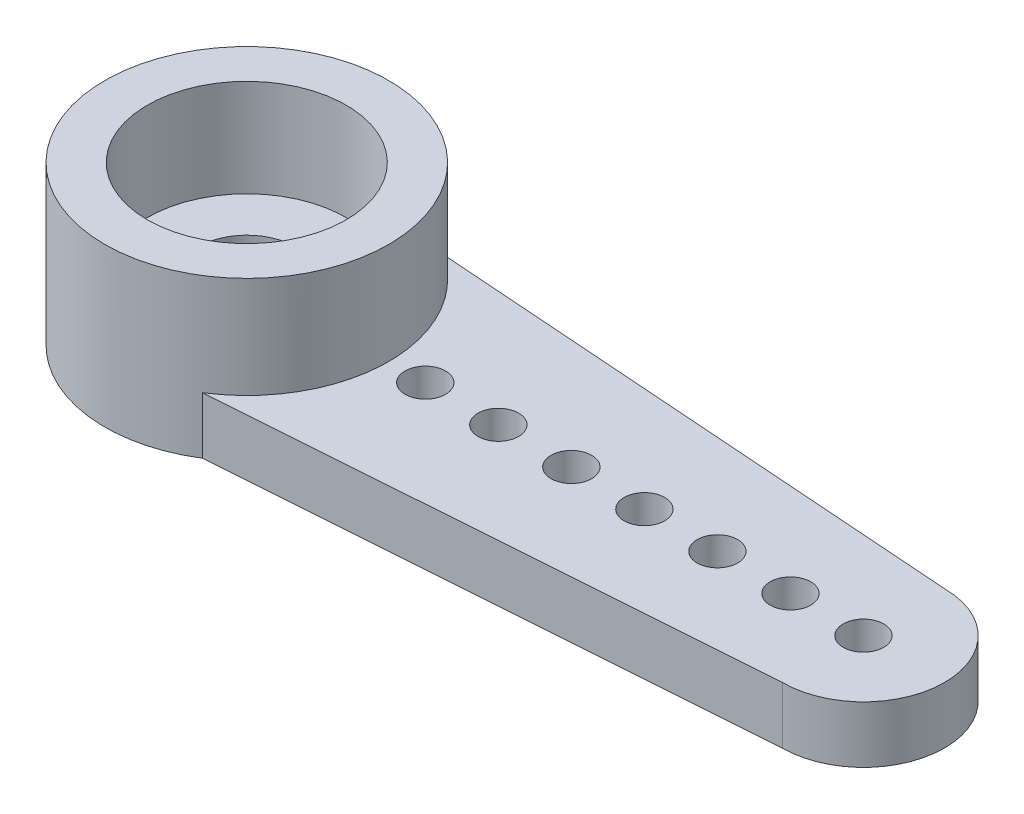
ISO-10303-21;
HEADER;
FILE_DESCRIPTION(('STEP AP214'),'2;1');
FILE_NAME('part.step','',(''),(''),'','','');
FILE_SCHEMA(('AUTOMOTIVE_DESIGN { 1 0 10303 214 1 1 1 1 }'));
ENDSEC;
DATA;
#1=APPLICATION_CONTEXT('core data for automotive mechanical design processes');
#2=APPLICATION_PROTOCOL_DEFINITION('international standard','automotive_design',2000,#1);
#3=PRODUCT_CONTEXT('',#1,'mechanical');
#4=PRODUCT('Part','Part','',(#3));
#5=PRODUCT_RELATED_PRODUCT_CATEGORY('part','',(#4));
#6=PRODUCT_DEFINITION_FORMATION('','',#4);
#7=PRODUCT_DEFINITION_CONTEXT('part definition',#1,'design');
#8=PRODUCT_DEFINITION('design','',#6,#7);
#9=PRODUCT_DEFINITION_SHAPE('','',#8);
#10=(LENGTH_UNIT() NAMED_UNIT(*) SI_UNIT(.MILLI.,.METRE.));
#11=(NAMED_UNIT(*) PLANE_ANGLE_UNIT() SI_UNIT($,.RADIAN.));
#12=(NAMED_UNIT(*) SI_UNIT($,.STERADIAN.) SOLID_ANGLE_UNIT());
#13=UNCERTAINTY_MEASURE_WITH_UNIT(LENGTH_MEASURE(1.E-05),#10,'distance_accuracy_value','');
#14=(GEOMETRIC_REPRESENTATION_CONTEXT(3) GLOBAL_UNCERTAINTY_ASSIGNED_CONTEXT((#13)) GLOBAL_UNIT_ASSIGNED_CONTEXT((#10,
#11,#12)) REPRESENTATION_CONTEXT('',''));
#15=CARTESIAN_POINT('',(0.,0.,0.));
#16=DIRECTION('',(0.,0.,1.));
#17=DIRECTION('',(1.,0.,0.));
#18=AXIS2_PLACEMENT_3D('',#15,#16,#17);
#19=CARTESIAN_POINT('',(-15.2,1.4,0.));
#20=DIRECTION('',(0.,1.,0.));
#21=DIRECTION('',(0.,0.,1.));
#22=AXIS2_PLACEMENT_3D('',#19,#20,#21);
#23=PLANE('',#22);
#24=CARTESIAN_POINT('',(6.2,1.4,0.));
#25=DIRECTION('',(0.,1.,0.));
#26=DIRECTION('',(0.,0.,1.));
#27=AXIS2_PLACEMENT_3D('',#24,#25,#26);
#28=CIRCLE('',#27,0.499999999999997);
#29=CARTESIAN_POINT('',(6.2,1.4,0.500000000000053));
#30=VERTEX_POINT('',#29);
#31=EDGE_CURVE('E126',#30,#30,#28,.T.);
#32=ORIENTED_EDGE('',*,*,#31,.F.);
#33=EDGE_LOOP('',(#32));
#34=FACE_BOUND('',#33,.T.);
#35=CARTESIAN_POINT('',(9.8,1.4,0.));
#36=DIRECTION('',(0.,1.,0.));
#37=DIRECTION('',(0.,0.,1.));
#38=AXIS2_PLACEMENT_3D('',#35,#36,#37);
#39=CIRCLE('',#38,0.499999999999997);
#40=CARTESIAN_POINT('',(9.8,1.4,0.500000000000028));
#41=VERTEX_POINT('',#40);
#42=EDGE_CURVE('E138',#41,#41,#39,.T.);
#43=ORIENTED_EDGE('',*,*,#42,.F.);
#44=EDGE_LOOP('',(#43));
#45=FACE_BOUND('',#44,.T.);
#46=CARTESIAN_POINT('',(13.4,1.4,0.));
#47=DIRECTION('',(0.,1.,0.));
#48=DIRECTION('',(0.,0.,1.));
#49=AXIS2_PLACEMENT_3D('',#46,#47,#48);
#50=CIRCLE('',#49,0.499999999999997);
#51=CARTESIAN_POINT('',(13.4,1.4,0.500000000000003));
#52=VERTEX_POINT('',#51);
#53=EDGE_CURVE('E150',#52,#52,#50,.T.);
#54=ORIENTED_EDGE('',*,*,#53,.F.);
#55=EDGE_LOOP('',(#54));
#56=FACE_BOUND('',#55,.T.);
#57=CARTESIAN_POINT('',(15.2,1.4,0.));
#58=DIRECTION('',(0.,1.,0.));
#59=DIRECTION('',(0.,0.,1.));
#60=AXIS2_PLACEMENT_3D('',#57,#58,#59);
#61=CIRCLE('',#60,0.499999999999997);
#62=CARTESIAN_POINT('',(15.2,1.4,0.49999999999999));
#63=VERTEX_POINT('',#62);
#64=EDGE_CURVE('E156',#63,#63,#61,.T.);
#65=ORIENTED_EDGE('',*,*,#64,.F.);
#66=EDGE_LOOP('',(#65));
#67=FACE_BOUND('',#66,.T.);
#68=CARTESIAN_POINT('',(11.6,1.4,0.));
#69=DIRECTION('',(0.,1.,0.));
#70=DIRECTION('',(0.,0.,1.));
#71=AXIS2_PLACEMENT_3D('',#68,#69,#70);
#72=CIRCLE('',#71,0.499999999999999);
#73=CARTESIAN_POINT('',(11.6,1.4,0.500000000000017));
#74=VERTEX_POINT('',#73);
#75=EDGE_CURVE('E144',#74,#74,#72,.T.);
#76=ORIENTED_EDGE('',*,*,#75,.F.);
#77=EDGE_LOOP('',(#76));
#78=FACE_BOUND('',#77,.T.);
#79=CARTESIAN_POINT('',(8.,1.4,0.));
#80=DIRECTION('',(0.,1.,0.));
#81=DIRECTION('',(0.,0.,1.));
#82=AXIS2_PLACEMENT_3D('',#79,#80,#81);
#83=CIRCLE('',#82,0.499999999999997);
#84=CARTESIAN_POINT('',(8.,1.4,0.500000000000041));
#85=VERTEX_POINT('',#84);
#86=EDGE_CURVE('E132',#85,#85,#83,.T.);
#87=ORIENTED_EDGE('',*,*,#86,.F.);
#88=EDGE_LOOP('',(#87));
#89=FACE_BOUND('',#88,.T.);
#90=CARTESIAN_POINT('',(4.4,1.4,0.));
#91=DIRECTION('',(0.,1.,0.));
#92=DIRECTION('',(0.,0.,1.));
#93=AXIS2_PLACEMENT_3D('',#90,#91,#92);
#94=CIRCLE('',#93,0.499999999999997);
#95=CARTESIAN_POINT('',(4.4,1.4,0.500000000000066));
#96=VERTEX_POINT('',#95);
#97=EDGE_CURVE('E120',#96,#96,#94,.T.);
#98=ORIENTED_EDGE('',*,*,#97,.F.);
#99=EDGE_LOOP('',(#98));
#100=FACE_BOUND('',#99,.T.);
#101=CARTESIAN_POINT('',(0.,1.4,0.));
#102=DIRECTION('',(0.,1.,0.));
#103=DIRECTION('',(0.,0.,1.));
#104=AXIS2_PLACEMENT_3D('',#101,#102,#103);
#105=CIRCLE('',#104,3.5);
#106=CARTESIAN_POINT('',(1.86858471289894,1.4,2.95945791838985));
#107=VERTEX_POINT('',#106);
#108=CARTESIAN_POINT('',(1.86858471289894,1.4,-2.95945791838985));
#109=VERTEX_POINT('',#108);
#110=EDGE_CURVE('E86',#107,#109,#105,.T.);
#111=ORIENTED_EDGE('',*,*,#110,.F.);
#112=DIRECTION('',(0.997420198870011,0.,-0.0717840294641297));
#113=VECTOR('',#112,1.);
#114=CARTESIAN_POINT('',(-14.9001527327747,1.4,4.16629887091939));
#115=LINE('',#114,#113);
#116=CARTESIAN_POINT('',(15.2,1.4,2.));
#117=VERTEX_POINT('',#116);
#118=EDGE_CURVE('E100',#107,#117,#115,.T.);
#119=ORIENTED_EDGE('',*,*,#118,.T.);
#120=CARTESIAN_POINT('',(15.2,1.4,0.));
#121=DIRECTION('',(0.,1.,0.));
#122=DIRECTION('',(0.,0.,-1.));
#123=AXIS2_PLACEMENT_3D('',#120,#121,#122);
#124=CIRCLE('',#123,2.);
#125=CARTESIAN_POINT('',(15.2,1.4,-2.));
#126=VERTEX_POINT('',#125);
#127=EDGE_CURVE('E162',#117,#126,#124,.T.);
#128=ORIENTED_EDGE('',*,*,#127,.T.);
#129=DIRECTION('',(-0.997420198870011,0.,-0.0717840294641295));
#130=VECTOR('',#129,1.);
#131=CARTESIAN_POINT('',(-14.9001527327747,1.4,-4.16629887091939));
#132=LINE('',#131,#130);
#133=EDGE_CURVE('E97',#126,#109,#132,.T.);
#134=ORIENTED_EDGE('',*,*,#133,.T.);
#135=EDGE_LOOP('',(#111,#119,#128,#134));
#136=FACE_BOUND('',#135,.T.);
#137=ADVANCED_FACE('F33',(#34,#45,#56,#67,#78,#89,#100,#136),#23,.T.);
#138=CARTESIAN_POINT('',(-15.2,0.,0.));
#139=DIRECTION('',(0.,1.,0.));
#140=DIRECTION('',(0.,0.,1.));
#141=AXIS2_PLACEMENT_3D('',#138,#139,#140);
#142=PLANE('',#141);
#143=CARTESIAN_POINT('',(0.,0.,0.));
#144=DIRECTION('',(0.,-1.,0.));
#145=DIRECTION('',(0.,0.,-1.));
#146=AXIS2_PLACEMENT_3D('',#143,#144,#145);
#147=CIRCLE('',#146,2.35);
#148=CARTESIAN_POINT('',(0.,0.,-2.35));
#149=VERTEX_POINT('',#148);
#150=EDGE_CURVE('E112',#149,#149,#147,.T.);
#151=ORIENTED_EDGE('',*,*,#150,.F.);
#152=EDGE_LOOP('',(#151));
#153=FACE_BOUND('',#152,.T.);
#154=CARTESIAN_POINT('',(15.2,0.,0.));
#155=DIRECTION('',(0.,1.,0.));
#156=DIRECTION('',(0.,0.,1.));
#157=AXIS2_PLACEMENT_3D('',#154,#155,#156);
#158=CIRCLE('',#157,0.499999999999997);
#159=CARTESIAN_POINT('',(15.2,0.,0.49999999999999));
#160=VERTEX_POINT('',#159);
#161=EDGE_CURVE('E153',#160,#160,#158,.T.);
#162=ORIENTED_EDGE('',*,*,#161,.T.);
#163=EDGE_LOOP('',(#162));
#164=FACE_BOUND('',#163,.T.);
#165=CARTESIAN_POINT('',(13.4,0.,0.));
#166=DIRECTION('',(0.,1.,0.));
#167=DIRECTION('',(0.,0.,1.));
#168=AXIS2_PLACEMENT_3D('',#165,#166,#167);
#169=CIRCLE('',#168,0.499999999999997);
#170=CARTESIAN_POINT('',(13.4,0.,0.500000000000003));
#171=VERTEX_POINT('',#170);
#172=EDGE_CURVE('E147',#171,#171,#169,.T.);
#173=ORIENTED_EDGE('',*,*,#172,.T.);
#174=EDGE_LOOP('',(#173));
#175=FACE_BOUND('',#174,.T.);
#176=CARTESIAN_POINT('',(11.6,0.,0.));
#177=DIRECTION('',(0.,1.,0.));
#178=DIRECTION('',(0.,0.,1.));
#179=AXIS2_PLACEMENT_3D('',#176,#177,#178);
#180=CIRCLE('',#179,0.499999999999999);
#181=CARTESIAN_POINT('',(11.6,0.,0.500000000000017));
#182=VERTEX_POINT('',#181);
#183=EDGE_CURVE('E141',#182,#182,#180,.T.);
#184=ORIENTED_EDGE('',*,*,#183,.T.);
#185=EDGE_LOOP('',(#184));
#186=FACE_BOUND('',#185,.T.);
#187=CARTESIAN_POINT('',(9.8,0.,0.));
#188=DIRECTION('',(0.,1.,0.));
#189=DIRECTION('',(0.,0.,1.));
#190=AXIS2_PLACEMENT_3D('',#187,#188,#189);
#191=CIRCLE('',#190,0.499999999999997);
#192=CARTESIAN_POINT('',(9.8,0.,0.500000000000028));
#193=VERTEX_POINT('',#192);
#194=EDGE_CURVE('E135',#193,#193,#191,.T.);
#195=ORIENTED_EDGE('',*,*,#194,.T.);
#196=EDGE_LOOP('',(#195));
#197=FACE_BOUND('',#196,.T.);
#198=CARTESIAN_POINT('',(8.,0.,0.));
#199=DIRECTION('',(0.,1.,0.));
#200=DIRECTION('',(0.,0.,1.));
#201=AXIS2_PLACEMENT_3D('',#198,#199,#200);
#202=CIRCLE('',#201,0.499999999999997);
#203=CARTESIAN_POINT('',(8.,0.,0.500000000000041));
#204=VERTEX_POINT('',#203);
#205=EDGE_CURVE('E129',#204,#204,#202,.T.);
#206=ORIENTED_EDGE('',*,*,#205,.T.);
#207=EDGE_LOOP('',(#206));
#208=FACE_BOUND('',#207,.T.);
#209=CARTESIAN_POINT('',(6.2,0.,0.));
#210=DIRECTION('',(0.,1.,0.));
#211=DIRECTION('',(0.,0.,1.));
#212=AXIS2_PLACEMENT_3D('',#209,#210,#211);
#213=CIRCLE('',#212,0.499999999999997);
#214=CARTESIAN_POINT('',(6.2,0.,0.500000000000053));
#215=VERTEX_POINT('',#214);
#216=EDGE_CURVE('E123',#215,#215,#213,.T.);
#217=ORIENTED_EDGE('',*,*,#216,.T.);
#218=EDGE_LOOP('',(#217));
#219=FACE_BOUND('',#218,.T.);
#220=CARTESIAN_POINT('',(4.4,0.,0.));
#221=DIRECTION('',(0.,1.,0.));
#222=DIRECTION('',(0.,0.,1.));
#223=AXIS2_PLACEMENT_3D('',#220,#221,#222);
#224=CIRCLE('',#223,0.499999999999997);
#225=CARTESIAN_POINT('',(4.4,0.,0.500000000000066));
#226=VERTEX_POINT('',#225);
#227=EDGE_CURVE('E117',#226,#226,#224,.T.);
#228=ORIENTED_EDGE('',*,*,#227,.T.);
#229=EDGE_LOOP('',(#228));
#230=FACE_BOUND('',#229,.T.);
#231=CARTESIAN_POINT('',(0.,0.,0.));
#232=DIRECTION('',(0.,-1.,0.));
#233=DIRECTION('',(0.,0.,-1.));
#234=AXIS2_PLACEMENT_3D('',#231,#232,#233);
#235=CIRCLE('',#234,3.5);
#236=CARTESIAN_POINT('',(1.86858471289894,0.,2.95945791838985));
#237=VERTEX_POINT('',#236);
#238=CARTESIAN_POINT('',(1.86858471289894,0.,-2.95945791838985));
#239=VERTEX_POINT('',#238);
#240=EDGE_CURVE('E71',#237,#239,#235,.T.);
#241=ORIENTED_EDGE('',*,*,#240,.T.);
#242=DIRECTION('',(0.997420198870011,0.,0.0717840294641295));
#243=VECTOR('',#242,1.);
#244=CARTESIAN_POINT('',(1.86858471289894,0.,-2.95945791838985));
#245=LINE('',#244,#243);
#246=CARTESIAN_POINT('',(15.2,0.,-2.));
#247=VERTEX_POINT('',#246);
#248=EDGE_CURVE('E76',#239,#247,#245,.T.);
#249=ORIENTED_EDGE('',*,*,#248,.T.);
#250=CARTESIAN_POINT('',(15.2,0.,0.));
#251=DIRECTION('',(0.,1.,0.));
#252=DIRECTION('',(0.,0.,-1.));
#253=AXIS2_PLACEMENT_3D('',#250,#251,#252);
#254=CIRCLE('',#253,2.);
#255=CARTESIAN_POINT('',(15.2,0.,1.99999999999999));
#256=VERTEX_POINT('',#255);
#257=EDGE_CURVE('E159',#256,#247,#254,.T.);
#258=ORIENTED_EDGE('',*,*,#257,.F.);
#259=DIRECTION('',(-0.997420198870011,0.,0.0717840294641296));
#260=VECTOR('',#259,1.);
#261=CARTESIAN_POINT('',(15.2,0.,2.));
#262=LINE('',#261,#260);
#263=EDGE_CURVE('E48',#256,#237,#262,.T.);
#264=ORIENTED_EDGE('',*,*,#263,.T.);
#265=EDGE_LOOP('',(#241,#249,#258,#264));
#266=FACE_BOUND('',#265,.T.);
#267=ADVANCED_FACE('F73',(#153,#164,#175,#186,#197,#208,#219,#230,#266),#142,.F.);
#268=CARTESIAN_POINT('',(15.2,1.4,0.));
#269=DIRECTION('',(0.,-1.,0.));
#270=DIRECTION('',(0.,0.,-1.));
#271=AXIS2_PLACEMENT_3D('',#268,#269,#270);
#272=CYLINDRICAL_SURFACE('',#271,2.);
#273=ORIENTED_EDGE('',*,*,#257,.T.);
#274=DIRECTION('',(0.,-1.,0.));
#275=VECTOR('',#274,1.);
#276=CARTESIAN_POINT('',(15.2,1.4,-2.00000000000001));
#277=LINE('',#276,#275);
#278=EDGE_CURVE('E93',#126,#247,#277,.T.);
#279=ORIENTED_EDGE('',*,*,#278,.F.);
#280=ORIENTED_EDGE('',*,*,#127,.F.);
#281=DIRECTION('',(0.,-1.,0.));
#282=VECTOR('',#281,1.);
#283=CARTESIAN_POINT('',(15.2,1.4,1.99999999999999));
#284=LINE('',#283,#282);
#285=EDGE_CURVE('E41',#117,#256,#284,.T.);
#286=ORIENTED_EDGE('',*,*,#285,.T.);
#287=EDGE_LOOP('',(#273,#279,#280,#286));
#288=FACE_BOUND('',#287,.T.);
#289=ADVANCED_FACE('F35',(#288),#272,.T.);
#290=CARTESIAN_POINT('',(15.2,1.4,0.));
#291=DIRECTION('',(0.,-1.,0.));
#292=DIRECTION('',(0.,0.,-1.));
#293=AXIS2_PLACEMENT_3D('',#290,#291,#292);
#294=CYLINDRICAL_SURFACE('',#293,0.499999999999997);
#295=ORIENTED_EDGE('',*,*,#64,.T.);
#296=EDGE_LOOP('',(#295));
#297=FACE_BOUND('',#296,.T.);
#298=ORIENTED_EDGE('',*,*,#161,.F.);
#299=EDGE_LOOP('',(#298));
#300=FACE_BOUND('',#299,.T.);
#301=ADVANCED_FACE('F222',(#297,#300),#294,.F.);
#302=CARTESIAN_POINT('',(13.4,1.4,0.));
#303=DIRECTION('',(0.,-1.,0.));
#304=DIRECTION('',(0.,0.,-1.));
#305=AXIS2_PLACEMENT_3D('',#302,#303,#304);
#306=CYLINDRICAL_SURFACE('',#305,0.499999999999997);
#307=ORIENTED_EDGE('',*,*,#53,.T.);
#308=EDGE_LOOP('',(#307));
#309=FACE_BOUND('',#308,.T.);
#310=ORIENTED_EDGE('',*,*,#172,.F.);
#311=EDGE_LOOP('',(#310));
#312=FACE_BOUND('',#311,.T.);
#313=ADVANCED_FACE('F225',(#309,#312),#306,.F.);
#314=CARTESIAN_POINT('',(11.6,1.4,0.));
#315=DIRECTION('',(0.,-1.,0.));
#316=DIRECTION('',(0.,0.,-1.));
#317=AXIS2_PLACEMENT_3D('',#314,#315,#316);
#318=CYLINDRICAL_SURFACE('',#317,0.499999999999999);
#319=ORIENTED_EDGE('',*,*,#75,.T.);
#320=EDGE_LOOP('',(#319));
#321=FACE_BOUND('',#320,.T.);
#322=ORIENTED_EDGE('',*,*,#183,.F.);
#323=EDGE_LOOP('',(#322));
#324=FACE_BOUND('',#323,.T.);
#325=ADVANCED_FACE('F229',(#321,#324),#318,.F.);
#326=CARTESIAN_POINT('',(9.8,1.4,0.));
#327=DIRECTION('',(0.,-1.,0.));
#328=DIRECTION('',(0.,0.,-1.));
#329=AXIS2_PLACEMENT_3D('',#326,#327,#328);
#330=CYLINDRICAL_SURFACE('',#329,0.499999999999997);
#331=ORIENTED_EDGE('',*,*,#42,.T.);
#332=EDGE_LOOP('',(#331));
#333=FACE_BOUND('',#332,.T.);
#334=ORIENTED_EDGE('',*,*,#194,.F.);
#335=EDGE_LOOP('',(#334));
#336=FACE_BOUND('',#335,.T.);
#337=ADVANCED_FACE('F233',(#333,#336),#330,.F.);
#338=CARTESIAN_POINT('',(8.,1.4,0.));
#339=DIRECTION('',(0.,-1.,0.));
#340=DIRECTION('',(0.,0.,-1.));
#341=AXIS2_PLACEMENT_3D('',#338,#339,#340);
#342=CYLINDRICAL_SURFACE('',#341,0.499999999999997);
#343=ORIENTED_EDGE('',*,*,#86,.T.);
#344=EDGE_LOOP('',(#343));
#345=FACE_BOUND('',#344,.T.);
#346=ORIENTED_EDGE('',*,*,#205,.F.);
#347=EDGE_LOOP('',(#346));
#348=FACE_BOUND('',#347,.T.);
#349=ADVANCED_FACE('F210',(#345,#348),#342,.F.);
#350=CARTESIAN_POINT('',(6.2,1.4,0.));
#351=DIRECTION('',(0.,-1.,0.));
#352=DIRECTION('',(0.,0.,-1.));
#353=AXIS2_PLACEMENT_3D('',#350,#351,#352);
#354=CYLINDRICAL_SURFACE('',#353,0.499999999999997);
#355=ORIENTED_EDGE('',*,*,#31,.T.);
#356=EDGE_LOOP('',(#355));
#357=FACE_BOUND('',#356,.T.);
#358=ORIENTED_EDGE('',*,*,#216,.F.);
#359=EDGE_LOOP('',(#358));
#360=FACE_BOUND('',#359,.T.);
#361=ADVANCED_FACE('F204',(#357,#360),#354,.F.);
#362=CARTESIAN_POINT('',(4.4,1.4,0.));
#363=DIRECTION('',(0.,-1.,0.));
#364=DIRECTION('',(0.,0.,-1.));
#365=AXIS2_PLACEMENT_3D('',#362,#363,#364);
#366=CYLINDRICAL_SURFACE('',#365,0.499999999999997);
#367=ORIENTED_EDGE('',*,*,#97,.T.);
#368=EDGE_LOOP('',(#367));
#369=FACE_BOUND('',#368,.T.);
#370=ORIENTED_EDGE('',*,*,#227,.F.);
#371=EDGE_LOOP('',(#370));
#372=FACE_BOUND('',#371,.T.);
#373=ADVANCED_FACE('F183',(#369,#372),#366,.F.);
#374=CARTESIAN_POINT('',(0.,1.,0.));
#375=DIRECTION('',(0.,-1.,0.));
#376=DIRECTION('',(0.,0.,-1.));
#377=AXIS2_PLACEMENT_3D('',#374,#375,#376);
#378=CYLINDRICAL_SURFACE('',#377,2.35);
#379=CARTESIAN_POINT('',(0.,1.,0.));
#380=DIRECTION('',(0.,-1.,0.));
#381=DIRECTION('',(0.,0.,-1.));
#382=AXIS2_PLACEMENT_3D('',#379,#380,#381);
#383=CIRCLE('',#382,2.35);
#384=CARTESIAN_POINT('',(0.,1.,-2.35));
#385=VERTEX_POINT('',#384);
#386=EDGE_CURVE('E114',#385,#385,#383,.T.);
#387=ORIENTED_EDGE('',*,*,#386,.F.);
#388=EDGE_LOOP('',(#387));
#389=FACE_BOUND('',#388,.T.);
#390=ORIENTED_EDGE('',*,*,#150,.T.);
#391=EDGE_LOOP('',(#390));
#392=FACE_BOUND('',#391,.T.);
#393=ADVANCED_FACE('F177',(#389,#392),#378,.F.);
#394=CARTESIAN_POINT('',(0.,1.,0.));
#395=DIRECTION('',(0.,-1.,0.));
#396=DIRECTION('',(0.,0.,-1.));
#397=AXIS2_PLACEMENT_3D('',#394,#395,#396);
#398=PLANE('',#397);
#399=CARTESIAN_POINT('',(0.,1.,0.));
#400=DIRECTION('',(0.,-1.,0.));
#401=DIRECTION('',(0.,0.,-1.));
#402=AXIS2_PLACEMENT_3D('',#399,#400,#401);
#403=CIRCLE('',#402,1.2);
#404=CARTESIAN_POINT('',(0.,1.,-1.2));
#405=VERTEX_POINT('',#404);
#406=EDGE_CURVE('E105',#405,#405,#403,.T.);
#407=ORIENTED_EDGE('',*,*,#406,.F.);
#408=EDGE_LOOP('',(#407));
#409=FACE_BOUND('',#408,.T.);
#410=ORIENTED_EDGE('',*,*,#386,.T.);
#411=EDGE_LOOP('',(#410));
#412=FACE_BOUND('',#411,.T.);
#413=ADVANCED_FACE('F173',(#409,#412),#398,.T.);
#414=CARTESIAN_POINT('',(0.,3.9,0.));
#415=DIRECTION('',(0.,1.,0.));
#416=DIRECTION('',(0.,0.,1.));
#417=AXIS2_PLACEMENT_3D('',#414,#415,#416);
#418=PLANE('',#417);
#419=CARTESIAN_POINT('',(0.,3.9,0.));
#420=DIRECTION('',(0.,1.,0.));
#421=DIRECTION('',(0.,0.,1.));
#422=AXIS2_PLACEMENT_3D('',#419,#420,#421);
#423=CIRCLE('',#422,3.5);
#424=CARTESIAN_POINT('',(0.,3.9,3.5));
#425=VERTEX_POINT('',#424);
#426=EDGE_CURVE('E109',#425,#425,#423,.T.);
#427=ORIENTED_EDGE('',*,*,#426,.T.);
#428=EDGE_LOOP('',(#427));
#429=FACE_BOUND('',#428,.T.);
#430=CARTESIAN_POINT('',(0.,3.9,0.));
#431=DIRECTION('',(0.,1.,0.));
#432=DIRECTION('',(0.,0.,1.));
#433=AXIS2_PLACEMENT_3D('',#430,#431,#432);
#434=CIRCLE('',#433,2.45);
#435=CARTESIAN_POINT('',(0.,3.9,2.45));
#436=VERTEX_POINT('',#435);
#437=EDGE_CURVE('E106',#436,#436,#434,.T.);
#438=ORIENTED_EDGE('',*,*,#437,.F.);
#439=EDGE_LOOP('',(#438));
#440=FACE_BOUND('',#439,.T.);
#441=ADVANCED_FACE('F176',(#429,#440),#418,.T.);
#442=CARTESIAN_POINT('',(0.,3.9,0.));
#443=DIRECTION('',(0.,-1.,0.));
#444=DIRECTION('',(0.,0.,-1.));
#445=AXIS2_PLACEMENT_3D('',#442,#443,#444);
#446=CYLINDRICAL_SURFACE('',#445,3.5);
#447=DIRECTION('',(0.,-1.,0.));
#448=VECTOR('',#447,1.);
#449=CARTESIAN_POINT('',(1.86858471289894,3.9,-2.95945791838985));
#450=LINE('',#449,#448);
#451=EDGE_CURVE('E80',#109,#239,#450,.T.);
#452=ORIENTED_EDGE('',*,*,#451,.T.);
#453=ORIENTED_EDGE('',*,*,#240,.F.);
#454=DIRECTION('',(0.,-1.,0.));
#455=VECTOR('',#454,1.);
#456=CARTESIAN_POINT('',(1.86858471289894,3.9,2.95945791838985));
#457=LINE('',#456,#455);
#458=EDGE_CURVE('E89',#107,#237,#457,.T.);
#459=ORIENTED_EDGE('',*,*,#458,.F.);
#460=ORIENTED_EDGE('',*,*,#110,.T.);
#461=EDGE_LOOP('',(#452,#453,#459,#460));
#462=FACE_BOUND('',#461,.T.);
#463=ORIENTED_EDGE('',*,*,#426,.F.);
#464=EDGE_LOOP('',(#463));
#465=FACE_BOUND('',#464,.T.);
#466=ADVANCED_FACE('F83',(#462,#465),#446,.T.);
#467=CARTESIAN_POINT('',(0.,3.9,0.));
#468=DIRECTION('',(0.,-1.,0.));
#469=DIRECTION('',(0.,0.,-1.));
#470=AXIS2_PLACEMENT_3D('',#467,#468,#469);
#471=CYLINDRICAL_SURFACE('',#470,2.45);
#472=CARTESIAN_POINT('',(0.,1.5,0.));
#473=DIRECTION('',(0.,1.,0.));
#474=DIRECTION('',(0.,0.,1.));
#475=AXIS2_PLACEMENT_3D('',#472,#473,#474);
#476=CIRCLE('',#475,2.45);
#477=CARTESIAN_POINT('',(0.,1.5,2.45));
#478=VERTEX_POINT('',#477);
#479=EDGE_CURVE('E11',#478,#478,#476,.T.);
#480=ORIENTED_EDGE('',*,*,#479,.F.);
#481=EDGE_LOOP('',(#480));
#482=FACE_BOUND('',#481,.T.);
#483=ORIENTED_EDGE('',*,*,#437,.T.);
#484=EDGE_LOOP('',(#483));
#485=FACE_BOUND('',#484,.T.);
#486=ADVANCED_FACE('F305',(#482,#485),#471,.F.);
#487=CARTESIAN_POINT('',(0.,0.,0.));
#488=DIRECTION('',(0.,1.,0.));
#489=DIRECTION('',(0.,0.,1.));
#490=AXIS2_PLACEMENT_3D('',#487,#488,#489);
#491=CYLINDRICAL_SURFACE('',#490,1.2);
#492=ORIENTED_EDGE('',*,*,#406,.T.);
#493=EDGE_LOOP('',(#492));
#494=FACE_BOUND('',#493,.T.);
#495=CARTESIAN_POINT('',(0.,1.5,0.));
#496=DIRECTION('',(0.,1.,0.));
#497=DIRECTION('',(0.,0.,1.));
#498=AXIS2_PLACEMENT_3D('',#495,#496,#497);
#499=CIRCLE('',#498,1.2);
#500=CARTESIAN_POINT('',(0.,1.5,1.2));
#501=VERTEX_POINT('',#500);
#502=EDGE_CURVE('E102',#501,#501,#499,.T.);
#503=ORIENTED_EDGE('',*,*,#502,.T.);
#504=EDGE_LOOP('',(#503));
#505=FACE_BOUND('',#504,.T.);
#506=ADVANCED_FACE('F170',(#494,#505),#491,.F.);
#507=CARTESIAN_POINT('',(0.,1.5,0.));
#508=DIRECTION('',(0.,1.,0.));
#509=DIRECTION('',(0.,0.,1.));
#510=AXIS2_PLACEMENT_3D('',#507,#508,#509);
#511=PLANE('',#510);
#512=ORIENTED_EDGE('',*,*,#479,.T.);
#513=EDGE_LOOP('',(#512));
#514=FACE_BOUND('',#513,.T.);
#515=ORIENTED_EDGE('',*,*,#502,.F.);
#516=EDGE_LOOP('',(#515));
#517=FACE_BOUND('',#516,.T.);
#518=ADVANCED_FACE('F321',(#514,#517),#511,.T.);
#519=CARTESIAN_POINT('',(1.86858471289894,3.9,-2.95945791838985));
#520=DIRECTION('',(0.0717840294641295,0.,-0.997420198870011));
#521=DIRECTION('',(-0.997420198870011,0.,-0.0717840294641295));
#522=AXIS2_PLACEMENT_3D('',#519,#520,#521);
#523=PLANE('',#522);
#524=ORIENTED_EDGE('',*,*,#278,.T.);
#525=ORIENTED_EDGE('',*,*,#248,.F.);
#526=ORIENTED_EDGE('',*,*,#451,.F.);
#527=ORIENTED_EDGE('',*,*,#133,.F.);
#528=EDGE_LOOP('',(#524,#525,#526,#527));
#529=FACE_BOUND('',#528,.T.);
#530=ADVANCED_FACE('F91',(#529),#523,.T.);
#531=CARTESIAN_POINT('',(15.2,3.9,2.));
#532=DIRECTION('',(0.0717840294641297,0.,0.997420198870011));
#533=DIRECTION('',(0.997420198870011,0.,-0.0717840294641297));
#534=AXIS2_PLACEMENT_3D('',#531,#532,#533);
#535=PLANE('',#534);
#536=ORIENTED_EDGE('',*,*,#458,.T.);
#537=ORIENTED_EDGE('',*,*,#263,.F.);
#538=ORIENTED_EDGE('',*,*,#285,.F.);
#539=ORIENTED_EDGE('',*,*,#118,.F.);
#540=EDGE_LOOP('',(#536,#537,#538,#539));
#541=FACE_BOUND('',#540,.T.);
#542=ADVANCED_FACE('F360',(#541),#535,.T.);
#543=CLOSED_SHELL('',(#137,#267,#289,#301,#313,#325,#337,#349,#361,#373,#393,#413,#441,#466,
#486,#506,#518,#530,#542));
#544=MANIFOLD_SOLID_BREP('B2',#543);
#545=ADVANCED_BREP_SHAPE_REPRESENTATION('',(#18,#544),#14);
#546=SHAPE_DEFINITION_REPRESENTATION(#9,#545);
ENDSEC;
END-ISO-10303-21;
